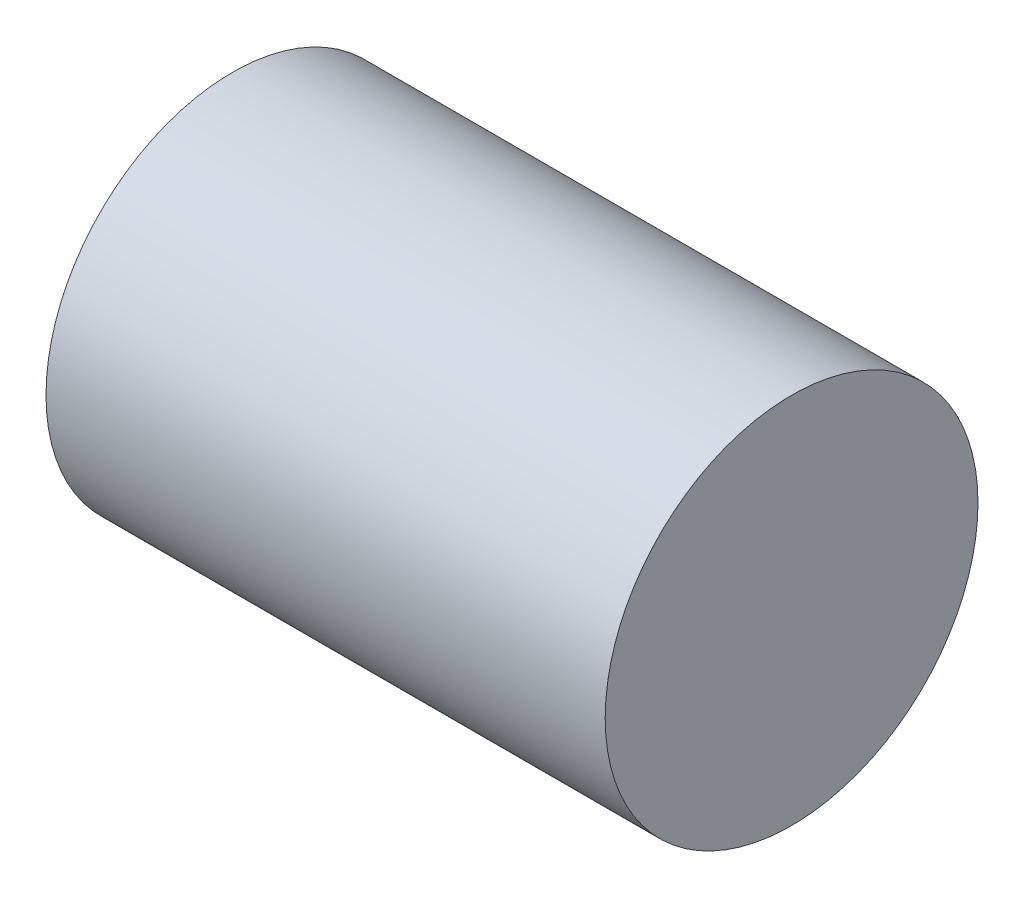
ISO-10303-21;
HEADER;
FILE_DESCRIPTION(('STEP AP214'),'2;1');
FILE_NAME('part.step','',(''),(''),'','','');
FILE_SCHEMA(('AUTOMOTIVE_DESIGN { 1 0 10303 214 1 1 1 1 }'));
ENDSEC;
DATA;
#1=APPLICATION_CONTEXT('core data for automotive mechanical design processes');
#2=APPLICATION_PROTOCOL_DEFINITION('international standard','automotive_design',2000,#1);
#3=PRODUCT_CONTEXT('',#1,'mechanical');
#4=PRODUCT('Part','Part','',(#3));
#5=PRODUCT_RELATED_PRODUCT_CATEGORY('part','',(#4));
#6=PRODUCT_DEFINITION_FORMATION('','',#4);
#7=PRODUCT_DEFINITION_CONTEXT('part definition',#1,'design');
#8=PRODUCT_DEFINITION('design','',#6,#7);
#9=PRODUCT_DEFINITION_SHAPE('','',#8);
#10=(LENGTH_UNIT() NAMED_UNIT(*) SI_UNIT(.MILLI.,.METRE.));
#11=(NAMED_UNIT(*) PLANE_ANGLE_UNIT() SI_UNIT($,.RADIAN.));
#12=(NAMED_UNIT(*) SI_UNIT($,.STERADIAN.) SOLID_ANGLE_UNIT());
#13=UNCERTAINTY_MEASURE_WITH_UNIT(LENGTH_MEASURE(1.E-05),#10,'distance_accuracy_value','');
#14=(GEOMETRIC_REPRESENTATION_CONTEXT(3) GLOBAL_UNCERTAINTY_ASSIGNED_CONTEXT((#13)) GLOBAL_UNIT_ASSIGNED_CONTEXT((#10,
#11,#12)) REPRESENTATION_CONTEXT('',''));
#15=CARTESIAN_POINT('',(0.,0.,0.));
#16=DIRECTION('',(0.,0.,1.));
#17=DIRECTION('',(1.,0.,0.));
#18=AXIS2_PLACEMENT_3D('',#15,#16,#17);
#19=CARTESIAN_POINT('',(19.05,0.,0.));
#20=DIRECTION('',(-1.,0.,0.));
#21=DIRECTION('',(0.,0.,1.));
#22=AXIS2_PLACEMENT_3D('',#19,#20,#21);
#23=CYLINDRICAL_SURFACE('',#22,6.35);
#24=CARTESIAN_POINT('',(19.05,0.,0.));
#25=DIRECTION('',(1.,0.,0.));
#26=DIRECTION('',(0.,0.,-1.));
#27=AXIS2_PLACEMENT_3D('',#24,#25,#26);
#28=CIRCLE('',#27,6.35);
#29=CARTESIAN_POINT('',(19.05,0.,6.35));
#30=VERTEX_POINT('',#29);
#31=EDGE_CURVE('E10',#30,#30,#28,.T.);
#32=CARTESIAN_POINT('',(0.,0.,0.));
#33=DIRECTION('',(1.,0.,0.));
#34=DIRECTION('',(0.,0.,-1.));
#35=AXIS2_PLACEMENT_3D('',#32,#33,#34);
#36=CIRCLE('',#35,6.35);
#37=CARTESIAN_POINT('',(0.,0.,6.35));
#38=VERTEX_POINT('',#37);
#39=EDGE_CURVE('E46',#38,#38,#36,.T.);
#40=CARTESIAN_POINT('',(19.05,0.,6.35));
#41=CARTESIAN_POINT('',(18.8515625,0.,6.35));
#42=CARTESIAN_POINT('',(18.653125,0.,6.35));
#43=CARTESIAN_POINT('',(18.25625,0.,6.35));
#44=CARTESIAN_POINT('',(18.0578125,0.,6.35));
#45=CARTESIAN_POINT('',(17.6609375,0.,6.35));
#46=CARTESIAN_POINT('',(17.4625,0.,6.35));
#47=CARTESIAN_POINT('',(17.065625,0.,6.35));
#48=CARTESIAN_POINT('',(16.8671875,0.,6.35));
#49=CARTESIAN_POINT('',(16.4703125,0.,6.35));
#50=CARTESIAN_POINT('',(16.271875,0.,6.35));
#51=CARTESIAN_POINT('',(15.875,0.,6.35));
#52=CARTESIAN_POINT('',(15.6765625,0.,6.35));
#53=CARTESIAN_POINT('',(15.2796875,0.,6.35));
#54=CARTESIAN_POINT('',(15.08125,0.,6.35));
#55=CARTESIAN_POINT('',(14.684375,0.,6.35));
#56=CARTESIAN_POINT('',(14.4859375,0.,6.35));
#57=CARTESIAN_POINT('',(14.0890625,0.,6.35));
#58=CARTESIAN_POINT('',(13.890625,0.,6.35));
#59=CARTESIAN_POINT('',(13.49375,0.,6.35));
#60=CARTESIAN_POINT('',(13.2953125,0.,6.35));
#61=CARTESIAN_POINT('',(12.8984375,0.,6.35));
#62=CARTESIAN_POINT('',(12.7,0.,6.35));
#63=CARTESIAN_POINT('',(12.303125,0.,6.35));
#64=CARTESIAN_POINT('',(12.1046875,0.,6.35));
#65=CARTESIAN_POINT('',(11.7078125,0.,6.35));
#66=CARTESIAN_POINT('',(11.509375,0.,6.35));
#67=CARTESIAN_POINT('',(11.1125,0.,6.35));
#68=CARTESIAN_POINT('',(10.9140625,0.,6.35));
#69=CARTESIAN_POINT('',(10.5171875,0.,6.35));
#70=CARTESIAN_POINT('',(10.31875,0.,6.35));
#71=CARTESIAN_POINT('',(9.921875,0.,6.35));
#72=CARTESIAN_POINT('',(9.7234375,0.,6.35));
#73=CARTESIAN_POINT('',(9.3265625,0.,6.35));
#74=CARTESIAN_POINT('',(9.128125,0.,6.35));
#75=CARTESIAN_POINT('',(8.73125,0.,6.35));
#76=CARTESIAN_POINT('',(8.5328125,0.,6.35));
#77=CARTESIAN_POINT('',(8.1359375,0.,6.35));
#78=CARTESIAN_POINT('',(7.9375,0.,6.35));
#79=CARTESIAN_POINT('',(7.540625,0.,6.35));
#80=CARTESIAN_POINT('',(7.3421875,0.,6.35));
#81=CARTESIAN_POINT('',(6.9453125,0.,6.35));
#82=CARTESIAN_POINT('',(6.746875,0.,6.35));
#83=CARTESIAN_POINT('',(6.35,0.,6.35));
#84=CARTESIAN_POINT('',(6.1515625,0.,6.35));
#85=CARTESIAN_POINT('',(5.7546875,0.,6.35));
#86=CARTESIAN_POINT('',(5.55625,0.,6.35));
#87=CARTESIAN_POINT('',(5.159375,0.,6.35));
#88=CARTESIAN_POINT('',(4.9609375,0.,6.35));
#89=CARTESIAN_POINT('',(4.5640625,0.,6.35));
#90=CARTESIAN_POINT('',(4.365625,0.,6.35));
#91=CARTESIAN_POINT('',(3.96875,0.,6.35));
#92=CARTESIAN_POINT('',(3.7703125,0.,6.35));
#93=CARTESIAN_POINT('',(3.3734375,0.,6.35));
#94=CARTESIAN_POINT('',(3.175,0.,6.35));
#95=CARTESIAN_POINT('',(2.778125,0.,6.35));
#96=CARTESIAN_POINT('',(2.5796875,0.,6.35));
#97=CARTESIAN_POINT('',(2.1828125,0.,6.35));
#98=CARTESIAN_POINT('',(1.984375,0.,6.35));
#99=CARTESIAN_POINT('',(1.5875,0.,6.35));
#100=CARTESIAN_POINT('',(1.3890625,0.,6.35));
#101=CARTESIAN_POINT('',(0.992187500000001,0.,6.35));
#102=CARTESIAN_POINT('',(0.793750000000001,0.,6.35));
#103=CARTESIAN_POINT('',(0.396875,0.,6.35));
#104=CARTESIAN_POINT('',(0.1984375,0.,6.35));
#105=CARTESIAN_POINT('',(0.,0.,6.35));
#106=B_SPLINE_CURVE_WITH_KNOTS('',3,(#40,#41,#42,#43,#44,#45,#46,#47,#48,#49,#50,#51,#52,#53,
#54,#55,#56,#57,#58,#59,#60,#61,#62,#63,#64,#65,#66,#67,#68,#69,#70,#71,#72,#73,#74,#75,#76,#77,
#78,#79,#80,#81,#82,#83,#84,#85,#86,#87,#88,#89,#90,#91,#92,#93,#94,#95,#96,#97,#98,#99,#100,
#101,#102,#103,#104,#105),.UNSPECIFIED.,.F.,.F.,(4,2,2,2,2,2,2,2,2,2,2,2,2,2,2,2,2,2,2,2,2,2,2,
2,2,2,2,2,2,2,2,2,4),(0.,0.5953125,1.190625,1.7859375,2.38125,2.9765625,3.571875,4.1671875,
4.7625,5.3578125,5.953125,6.5484375,7.14375,7.7390625,8.334375,8.9296875,9.525,10.1203125,
10.715625,11.3109375,11.90625,12.5015625,13.096875,13.6921875,14.2875,14.8828125,15.478125,
16.0734375,16.66875,17.2640625,17.859375,18.4546875,19.05),.UNSPECIFIED.);
#107=EDGE_CURVE('BSEAM43',#30,#38,#106,.T.);
#108=ORIENTED_EDGE('',*,*,#31,.F.);
#109=ORIENTED_EDGE('',*,*,#39,.T.);
#110=ORIENTED_EDGE('',*,*,#107,.T.);
#111=ORIENTED_EDGE('',*,*,#107,.F.);
#112=EDGE_LOOP('',(#108,#110,#109,#111));
#113=FACE_BOUND('',#112,.T.);
#114=ADVANCED_FACE('F43',(#113),#23,.T.);
#115=CARTESIAN_POINT('',(19.05,0.,0.));
#116=DIRECTION('',(1.,0.,0.));
#117=DIRECTION('',(0.,0.,-1.));
#118=AXIS2_PLACEMENT_3D('',#115,#116,#117);
#119=PLANE('',#118);
#120=ORIENTED_EDGE('',*,*,#31,.T.);
#121=EDGE_LOOP('',(#120));
#122=FACE_BOUND('',#121,.T.);
#123=ADVANCED_FACE('F60',(#122),#119,.T.);
#124=CARTESIAN_POINT('',(0.,0.,0.));
#125=DIRECTION('',(1.,0.,0.));
#126=DIRECTION('',(0.,0.,-1.));
#127=AXIS2_PLACEMENT_3D('',#124,#125,#126);
#128=PLANE('',#127);
#129=ORIENTED_EDGE('',*,*,#39,.F.);
#130=EDGE_LOOP('',(#129));
#131=FACE_BOUND('',#130,.T.);
#132=ADVANCED_FACE('F58',(#131),#128,.F.);
#133=CLOSED_SHELL('',(#114,#123,#132));
#134=MANIFOLD_SOLID_BREP('B2',#133);
#135=ADVANCED_BREP_SHAPE_REPRESENTATION('',(#18,#134),#14);
#136=SHAPE_DEFINITION_REPRESENTATION(#9,#135);
ENDSEC;
END-ISO-10303-21;
